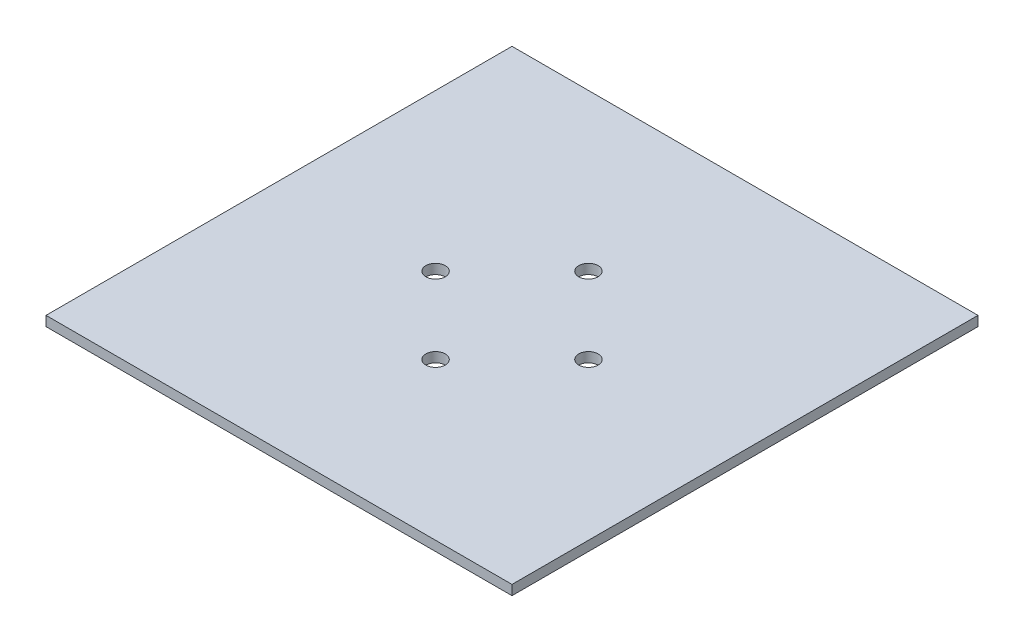
ISO-10303-21;
HEADER;
FILE_DESCRIPTION(('STEP AP214'),'2;1');
FILE_NAME('part.step','',(''),(''),'','','');
FILE_SCHEMA(('AUTOMOTIVE_DESIGN { 1 0 10303 214 1 1 1 1 }'));
ENDSEC;
DATA;
#1=APPLICATION_CONTEXT('core data for automotive mechanical design processes');
#2=APPLICATION_PROTOCOL_DEFINITION('international standard','automotive_design',2000,#1);
#3=PRODUCT_CONTEXT('',#1,'mechanical');
#4=PRODUCT('Part','Part','',(#3));
#5=PRODUCT_RELATED_PRODUCT_CATEGORY('part','',(#4));
#6=PRODUCT_DEFINITION_FORMATION('','',#4);
#7=PRODUCT_DEFINITION_CONTEXT('part definition',#1,'design');
#8=PRODUCT_DEFINITION('design','',#6,#7);
#9=PRODUCT_DEFINITION_SHAPE('','',#8);
#10=(LENGTH_UNIT() NAMED_UNIT(*) SI_UNIT(.MILLI.,.METRE.));
#11=(NAMED_UNIT(*) PLANE_ANGLE_UNIT() SI_UNIT($,.RADIAN.));
#12=(NAMED_UNIT(*) SI_UNIT($,.STERADIAN.) SOLID_ANGLE_UNIT());
#13=UNCERTAINTY_MEASURE_WITH_UNIT(LENGTH_MEASURE(1.E-05),#10,'distance_accuracy_value','');
#14=(GEOMETRIC_REPRESENTATION_CONTEXT(3) GLOBAL_UNCERTAINTY_ASSIGNED_CONTEXT((#13)) GLOBAL_UNIT_ASSIGNED_CONTEXT((#10,
#11,#12)) REPRESENTATION_CONTEXT('',''));
#15=CARTESIAN_POINT('',(0.,0.,0.));
#16=DIRECTION('',(0.,0.,1.));
#17=DIRECTION('',(1.,0.,0.));
#18=AXIS2_PLACEMENT_3D('',#15,#16,#17);
#19=CARTESIAN_POINT('',(38.1,1.6002,38.1));
#20=DIRECTION('',(-1.,0.,0.));
#21=DIRECTION('',(0.,0.,1.));
#22=AXIS2_PLACEMENT_3D('',#19,#20,#21);
#23=PLANE('',#22);
#24=DIRECTION('',(0.,0.,-1.));
#25=VECTOR('',#24,1.);
#26=CARTESIAN_POINT('',(38.1,0.,38.1));
#27=LINE('',#26,#25);
#28=CARTESIAN_POINT('',(38.1,0.,38.1));
#29=VERTEX_POINT('',#28);
#30=CARTESIAN_POINT('',(38.1,0.,-38.1));
#31=VERTEX_POINT('',#30);
#32=EDGE_CURVE('E96',#29,#31,#27,.T.);
#33=ORIENTED_EDGE('',*,*,#32,.T.);
#34=DIRECTION('',(0.,-1.,0.));
#35=VECTOR('',#34,1.);
#36=CARTESIAN_POINT('',(38.1,1.6002,-38.1));
#37=LINE('',#36,#35);
#38=CARTESIAN_POINT('',(38.1,1.6002,-38.1));
#39=VERTEX_POINT('',#38);
#40=EDGE_CURVE('E11',#39,#31,#37,.T.);
#41=ORIENTED_EDGE('',*,*,#40,.F.);
#42=DIRECTION('',(0.,0.,-1.));
#43=VECTOR('',#42,1.);
#44=CARTESIAN_POINT('',(38.1,1.6002,38.1));
#45=LINE('',#44,#43);
#46=CARTESIAN_POINT('',(38.1,1.6002,38.1));
#47=VERTEX_POINT('',#46);
#48=EDGE_CURVE('E84',#47,#39,#45,.T.);
#49=ORIENTED_EDGE('',*,*,#48,.F.);
#50=DIRECTION('',(0.,-1.,0.));
#51=VECTOR('',#50,1.);
#52=CARTESIAN_POINT('',(38.1,1.6002,38.1));
#53=LINE('',#52,#51);
#54=EDGE_CURVE('E92',#47,#29,#53,.T.);
#55=ORIENTED_EDGE('',*,*,#54,.T.);
#56=EDGE_LOOP('',(#33,#41,#49,#55));
#57=FACE_BOUND('',#56,.T.);
#58=ADVANCED_FACE('F33',(#57),#23,.F.);
#59=CARTESIAN_POINT('',(-38.1,1.6002,-38.1));
#60=DIRECTION('',(0.,0.,1.));
#61=DIRECTION('',(1.,0.,0.));
#62=AXIS2_PLACEMENT_3D('',#59,#60,#61);
#63=PLANE('',#62);
#64=DIRECTION('',(-1.,0.,0.));
#65=VECTOR('',#64,1.);
#66=CARTESIAN_POINT('',(-38.1,0.,-38.1));
#67=LINE('',#66,#65);
#68=CARTESIAN_POINT('',(-38.1,0.,-38.1));
#69=VERTEX_POINT('',#68);
#70=EDGE_CURVE('E88',#31,#69,#67,.T.);
#71=ORIENTED_EDGE('',*,*,#70,.T.);
#72=DIRECTION('',(0.,-1.,0.));
#73=VECTOR('',#72,1.);
#74=CARTESIAN_POINT('',(-38.1,1.6002,-38.1));
#75=LINE('',#74,#73);
#76=CARTESIAN_POINT('',(-38.1,1.6002,-38.1));
#77=VERTEX_POINT('',#76);
#78=EDGE_CURVE('E41',#77,#69,#75,.T.);
#79=ORIENTED_EDGE('',*,*,#78,.F.);
#80=DIRECTION('',(-1.,0.,0.));
#81=VECTOR('',#80,1.);
#82=CARTESIAN_POINT('',(-38.1,1.6002,-38.1));
#83=LINE('',#82,#81);
#84=EDGE_CURVE('E79',#39,#77,#83,.T.);
#85=ORIENTED_EDGE('',*,*,#84,.F.);
#86=ORIENTED_EDGE('',*,*,#40,.T.);
#87=EDGE_LOOP('',(#71,#79,#85,#86));
#88=FACE_BOUND('',#87,.T.);
#89=ADVANCED_FACE('F87',(#88),#63,.F.);
#90=CARTESIAN_POINT('',(-38.1,1.6002,38.1));
#91=DIRECTION('',(1.,0.,0.));
#92=DIRECTION('',(0.,0.,-1.));
#93=AXIS2_PLACEMENT_3D('',#90,#91,#92);
#94=PLANE('',#93);
#95=DIRECTION('',(0.,0.,1.));
#96=VECTOR('',#95,1.);
#97=CARTESIAN_POINT('',(-38.1,0.,38.1));
#98=LINE('',#97,#96);
#99=CARTESIAN_POINT('',(-38.1,0.,38.1));
#100=VERTEX_POINT('',#99);
#101=EDGE_CURVE('E66',#69,#100,#98,.T.);
#102=ORIENTED_EDGE('',*,*,#101,.T.);
#103=DIRECTION('',(0.,-1.,0.));
#104=VECTOR('',#103,1.);
#105=CARTESIAN_POINT('',(-38.1,1.6002,38.1));
#106=LINE('',#105,#104);
#107=CARTESIAN_POINT('',(-38.1,1.6002,38.1));
#108=VERTEX_POINT('',#107);
#109=EDGE_CURVE('E89',#108,#100,#106,.T.);
#110=ORIENTED_EDGE('',*,*,#109,.F.);
#111=DIRECTION('',(0.,0.,1.));
#112=VECTOR('',#111,1.);
#113=CARTESIAN_POINT('',(-38.1,1.6002,38.1));
#114=LINE('',#113,#112);
#115=EDGE_CURVE('E82',#77,#108,#114,.T.);
#116=ORIENTED_EDGE('',*,*,#115,.F.);
#117=ORIENTED_EDGE('',*,*,#78,.T.);
#118=EDGE_LOOP('',(#102,#110,#116,#117));
#119=FACE_BOUND('',#118,.T.);
#120=ADVANCED_FACE('F90',(#119),#94,.F.);
#121=CARTESIAN_POINT('',(-38.1,1.6002,38.1));
#122=DIRECTION('',(0.,0.,-1.));
#123=DIRECTION('',(-1.,0.,0.));
#124=AXIS2_PLACEMENT_3D('',#121,#122,#123);
#125=PLANE('',#124);
#126=DIRECTION('',(1.,0.,0.));
#127=VECTOR('',#126,1.);
#128=CARTESIAN_POINT('',(-38.1,0.,38.1));
#129=LINE('',#128,#127);
#130=EDGE_CURVE('E72',#100,#29,#129,.T.);
#131=ORIENTED_EDGE('',*,*,#130,.T.);
#132=ORIENTED_EDGE('',*,*,#54,.F.);
#133=DIRECTION('',(1.,0.,0.));
#134=VECTOR('',#133,1.);
#135=CARTESIAN_POINT('',(-38.1,1.6002,38.1));
#136=LINE('',#135,#134);
#137=EDGE_CURVE('E49',#108,#47,#136,.T.);
#138=ORIENTED_EDGE('',*,*,#137,.F.);
#139=ORIENTED_EDGE('',*,*,#109,.T.);
#140=EDGE_LOOP('',(#131,#132,#138,#139));
#141=FACE_BOUND('',#140,.T.);
#142=ADVANCED_FACE('F104',(#141),#125,.F.);
#143=CARTESIAN_POINT('',(0.,1.6002,0.));
#144=DIRECTION('',(0.,-1.,0.));
#145=DIRECTION('',(0.,0.,-1.));
#146=AXIS2_PLACEMENT_3D('',#143,#144,#145);
#147=PLANE('',#146);
#148=CARTESIAN_POINT('',(0.,1.6002,-12.5));
#149=DIRECTION('',(0.,-1.,0.));
#150=DIRECTION('',(0.,0.,-1.));
#151=AXIS2_PLACEMENT_3D('',#148,#149,#150);
#152=CIRCLE('',#151,1.58749999999999);
#153=CARTESIAN_POINT('',(0.,1.6002,-14.0875));
#154=VERTEX_POINT('',#153);
#155=EDGE_CURVE('E127',#154,#154,#152,.T.);
#156=ORIENTED_EDGE('',*,*,#155,.T.);
#157=EDGE_LOOP('',(#156));
#158=FACE_BOUND('',#157,.T.);
#159=CARTESIAN_POINT('',(0.,1.6002,12.5));
#160=DIRECTION('',(0.,-1.,0.));
#161=DIRECTION('',(0.,0.,-1.));
#162=AXIS2_PLACEMENT_3D('',#159,#160,#161);
#163=CIRCLE('',#162,1.58749999999999);
#164=CARTESIAN_POINT('',(0.,1.6002,10.9125));
#165=VERTEX_POINT('',#164);
#166=EDGE_CURVE('E121',#165,#165,#163,.T.);
#167=ORIENTED_EDGE('',*,*,#166,.T.);
#168=EDGE_LOOP('',(#167));
#169=FACE_BOUND('',#168,.T.);
#170=CARTESIAN_POINT('',(-12.5,1.6002,0.));
#171=DIRECTION('',(0.,-1.,0.));
#172=DIRECTION('',(0.,0.,-1.));
#173=AXIS2_PLACEMENT_3D('',#170,#171,#172);
#174=CIRCLE('',#173,1.58749999999999);
#175=CARTESIAN_POINT('',(-12.5,1.6002,-1.58749999999999));
#176=VERTEX_POINT('',#175);
#177=EDGE_CURVE('E115',#176,#176,#174,.T.);
#178=ORIENTED_EDGE('',*,*,#177,.T.);
#179=EDGE_LOOP('',(#178));
#180=FACE_BOUND('',#179,.T.);
#181=CARTESIAN_POINT('',(12.5,1.6002,0.));
#182=DIRECTION('',(0.,-1.,0.));
#183=DIRECTION('',(0.,0.,-1.));
#184=AXIS2_PLACEMENT_3D('',#181,#182,#183);
#185=CIRCLE('',#184,1.58749999999999);
#186=CARTESIAN_POINT('',(12.5,1.6002,-1.58749999999999));
#187=VERTEX_POINT('',#186);
#188=EDGE_CURVE('E99',#187,#187,#185,.T.);
#189=ORIENTED_EDGE('',*,*,#188,.T.);
#190=EDGE_LOOP('',(#189));
#191=FACE_BOUND('',#190,.T.);
#192=ORIENTED_EDGE('',*,*,#48,.T.);
#193=ORIENTED_EDGE('',*,*,#84,.T.);
#194=ORIENTED_EDGE('',*,*,#115,.T.);
#195=ORIENTED_EDGE('',*,*,#137,.T.);
#196=EDGE_LOOP('',(#192,#193,#194,#195));
#197=FACE_BOUND('',#196,.T.);
#198=ADVANCED_FACE('F80',(#158,#169,#180,#191,#197),#147,.F.);
#199=CARTESIAN_POINT('',(0.,0.,0.));
#200=DIRECTION('',(0.,-1.,0.));
#201=DIRECTION('',(0.,0.,-1.));
#202=AXIS2_PLACEMENT_3D('',#199,#200,#201);
#203=PLANE('',#202);
#204=CARTESIAN_POINT('',(0.,0.,-12.5));
#205=DIRECTION('',(0.,-1.,0.));
#206=DIRECTION('',(0.,0.,-1.));
#207=AXIS2_PLACEMENT_3D('',#204,#205,#206);
#208=CIRCLE('',#207,1.58749999999999);
#209=CARTESIAN_POINT('',(0.,0.,-14.0875));
#210=VERTEX_POINT('',#209);
#211=EDGE_CURVE('E130',#210,#210,#208,.T.);
#212=ORIENTED_EDGE('',*,*,#211,.F.);
#213=EDGE_LOOP('',(#212));
#214=FACE_BOUND('',#213,.T.);
#215=CARTESIAN_POINT('',(0.,0.,12.5));
#216=DIRECTION('',(0.,-1.,0.));
#217=DIRECTION('',(0.,0.,-1.));
#218=AXIS2_PLACEMENT_3D('',#215,#216,#217);
#219=CIRCLE('',#218,1.58749999999999);
#220=CARTESIAN_POINT('',(0.,0.,10.9125));
#221=VERTEX_POINT('',#220);
#222=EDGE_CURVE('E124',#221,#221,#219,.T.);
#223=ORIENTED_EDGE('',*,*,#222,.F.);
#224=EDGE_LOOP('',(#223));
#225=FACE_BOUND('',#224,.T.);
#226=CARTESIAN_POINT('',(-12.5,0.,0.));
#227=DIRECTION('',(0.,-1.,0.));
#228=DIRECTION('',(0.,0.,-1.));
#229=AXIS2_PLACEMENT_3D('',#226,#227,#228);
#230=CIRCLE('',#229,1.58749999999999);
#231=CARTESIAN_POINT('',(-12.5,0.,-1.58749999999999));
#232=VERTEX_POINT('',#231);
#233=EDGE_CURVE('E118',#232,#232,#230,.T.);
#234=ORIENTED_EDGE('',*,*,#233,.F.);
#235=EDGE_LOOP('',(#234));
#236=FACE_BOUND('',#235,.T.);
#237=CARTESIAN_POINT('',(12.5,0.,0.));
#238=DIRECTION('',(0.,-1.,0.));
#239=DIRECTION('',(0.,0.,-1.));
#240=AXIS2_PLACEMENT_3D('',#237,#238,#239);
#241=CIRCLE('',#240,1.58749999999999);
#242=CARTESIAN_POINT('',(12.5,0.,-1.58749999999999));
#243=VERTEX_POINT('',#242);
#244=EDGE_CURVE('E112',#243,#243,#241,.T.);
#245=ORIENTED_EDGE('',*,*,#244,.F.);
#246=EDGE_LOOP('',(#245));
#247=FACE_BOUND('',#246,.T.);
#248=ORIENTED_EDGE('',*,*,#32,.F.);
#249=ORIENTED_EDGE('',*,*,#130,.F.);
#250=ORIENTED_EDGE('',*,*,#101,.F.);
#251=ORIENTED_EDGE('',*,*,#70,.F.);
#252=EDGE_LOOP('',(#248,#249,#250,#251));
#253=FACE_BOUND('',#252,.T.);
#254=ADVANCED_FACE('F107',(#214,#225,#236,#247,#253),#203,.T.);
#255=CARTESIAN_POINT('',(12.5,0.,0.));
#256=DIRECTION('',(0.,-1.,0.));
#257=DIRECTION('',(0.,0.,-1.));
#258=AXIS2_PLACEMENT_3D('',#255,#256,#257);
#259=CYLINDRICAL_SURFACE('',#258,1.58749999999999);
#260=ORIENTED_EDGE('',*,*,#188,.F.);
#261=EDGE_LOOP('',(#260));
#262=FACE_BOUND('',#261,.T.);
#263=ORIENTED_EDGE('',*,*,#244,.T.);
#264=EDGE_LOOP('',(#263));
#265=FACE_BOUND('',#264,.T.);
#266=ADVANCED_FACE('F138',(#262,#265),#259,.F.);
#267=CARTESIAN_POINT('',(-12.5,0.,0.));
#268=DIRECTION('',(0.,-1.,0.));
#269=DIRECTION('',(0.,0.,-1.));
#270=AXIS2_PLACEMENT_3D('',#267,#268,#269);
#271=CYLINDRICAL_SURFACE('',#270,1.58749999999999);
#272=ORIENTED_EDGE('',*,*,#177,.F.);
#273=EDGE_LOOP('',(#272));
#274=FACE_BOUND('',#273,.T.);
#275=ORIENTED_EDGE('',*,*,#233,.T.);
#276=EDGE_LOOP('',(#275));
#277=FACE_BOUND('',#276,.T.);
#278=ADVANCED_FACE('F147',(#274,#277),#271,.F.);
#279=CARTESIAN_POINT('',(0.,0.,12.5));
#280=DIRECTION('',(0.,-1.,0.));
#281=DIRECTION('',(0.,0.,-1.));
#282=AXIS2_PLACEMENT_3D('',#279,#280,#281);
#283=CYLINDRICAL_SURFACE('',#282,1.58749999999999);
#284=ORIENTED_EDGE('',*,*,#166,.F.);
#285=EDGE_LOOP('',(#284));
#286=FACE_BOUND('',#285,.T.);
#287=ORIENTED_EDGE('',*,*,#222,.T.);
#288=EDGE_LOOP('',(#287));
#289=FACE_BOUND('',#288,.T.);
#290=ADVANCED_FACE('F153',(#286,#289),#283,.F.);
#291=CARTESIAN_POINT('',(0.,0.,-12.5));
#292=DIRECTION('',(0.,-1.,0.));
#293=DIRECTION('',(0.,0.,-1.));
#294=AXIS2_PLACEMENT_3D('',#291,#292,#293);
#295=CYLINDRICAL_SURFACE('',#294,1.58749999999999);
#296=ORIENTED_EDGE('',*,*,#155,.F.);
#297=EDGE_LOOP('',(#296));
#298=FACE_BOUND('',#297,.T.);
#299=ORIENTED_EDGE('',*,*,#211,.T.);
#300=EDGE_LOOP('',(#299));
#301=FACE_BOUND('',#300,.T.);
#302=ADVANCED_FACE('F134',(#298,#301),#295,.F.);
#303=CLOSED_SHELL('',(#58,#89,#120,#142,#198,#254,#266,#278,#290,#302));
#304=MANIFOLD_SOLID_BREP('B2',#303);
#305=ADVANCED_BREP_SHAPE_REPRESENTATION('',(#18,#304),#14);
#306=SHAPE_DEFINITION_REPRESENTATION(#9,#305);
ENDSEC;
END-ISO-10303-21;
